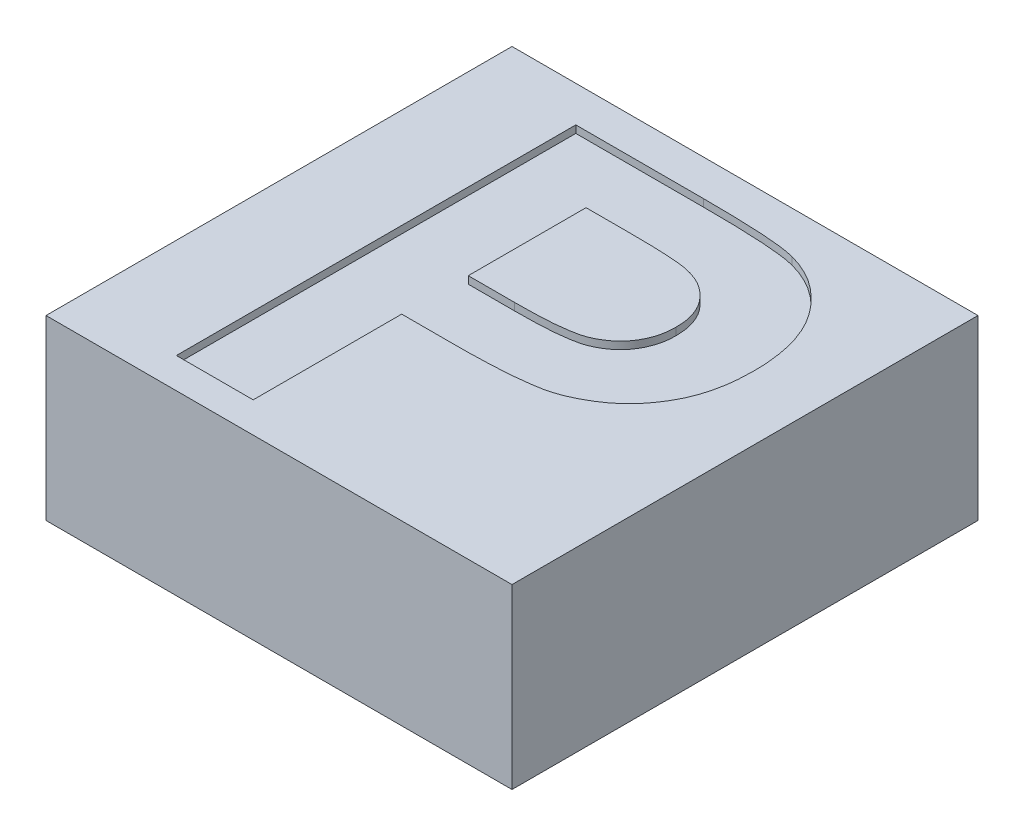
ISO-10303-21;
HEADER;
FILE_DESCRIPTION(('STEP AP214'),'2;1');
FILE_NAME('part.step','',(''),(''),'','','');
FILE_SCHEMA(('AUTOMOTIVE_DESIGN { 1 0 10303 214 1 1 1 1 }'));
ENDSEC;
DATA;
#1=APPLICATION_CONTEXT('core data for automotive mechanical design processes');
#2=APPLICATION_PROTOCOL_DEFINITION('international standard','automotive_design',2000,#1);
#3=PRODUCT_CONTEXT('',#1,'mechanical');
#4=PRODUCT('Part','Part','',(#3));
#5=PRODUCT_RELATED_PRODUCT_CATEGORY('part','',(#4));
#6=PRODUCT_DEFINITION_FORMATION('','',#4);
#7=PRODUCT_DEFINITION_CONTEXT('part definition',#1,'design');
#8=PRODUCT_DEFINITION('design','',#6,#7);
#9=PRODUCT_DEFINITION_SHAPE('','',#8);
#10=(LENGTH_UNIT() NAMED_UNIT(*) SI_UNIT(.MILLI.,.METRE.));
#11=(NAMED_UNIT(*) PLANE_ANGLE_UNIT() SI_UNIT($,.RADIAN.));
#12=(NAMED_UNIT(*) SI_UNIT($,.STERADIAN.) SOLID_ANGLE_UNIT());
#13=UNCERTAINTY_MEASURE_WITH_UNIT(LENGTH_MEASURE(1.E-05),#10,'distance_accuracy_value','');
#14=(GEOMETRIC_REPRESENTATION_CONTEXT(3) GLOBAL_UNCERTAINTY_ASSIGNED_CONTEXT((#13)) GLOBAL_UNIT_ASSIGNED_CONTEXT((#10,
#11,#12)) REPRESENTATION_CONTEXT('',''));
#15=CARTESIAN_POINT('',(0.,0.,0.));
#16=DIRECTION('',(0.,0.,1.));
#17=DIRECTION('',(1.,0.,0.));
#18=AXIS2_PLACEMENT_3D('',#15,#16,#17);
#19=CARTESIAN_POINT('',(0.,12.,0.));
#20=DIRECTION('',(0.,-1.,0.));
#21=DIRECTION('',(0.,0.,-1.));
#22=AXIS2_PLACEMENT_3D('',#19,#20,#21);
#23=PLANE('',#22);
#24=DIRECTION('',(0.,0.,1.));
#25=VECTOR('',#24,1.);
#26=CARTESIAN_POINT('',(0.,12.,0.));
#27=LINE('',#26,#25);
#28=CARTESIAN_POINT('',(0.,12.,-31.5));
#29=VERTEX_POINT('',#28);
#30=CARTESIAN_POINT('',(0.,12.,0.));
#31=VERTEX_POINT('',#30);
#32=EDGE_CURVE('E368',#29,#31,#27,.T.);
#33=ORIENTED_EDGE('',*,*,#32,.T.);
#34=DIRECTION('',(1.,0.,0.));
#35=VECTOR('',#34,1.);
#36=CARTESIAN_POINT('',(0.,12.,0.));
#37=LINE('',#36,#35);
#38=CARTESIAN_POINT('',(31.5,12.,0.));
#39=VERTEX_POINT('',#38);
#40=EDGE_CURVE('E372',#31,#39,#37,.T.);
#41=ORIENTED_EDGE('',*,*,#40,.T.);
#42=DIRECTION('',(0.,0.,-1.));
#43=VECTOR('',#42,1.);
#44=CARTESIAN_POINT('',(31.5,12.,0.));
#45=LINE('',#44,#43);
#46=CARTESIAN_POINT('',(31.5,12.,-31.5));
#47=VERTEX_POINT('',#46);
#48=EDGE_CURVE('E376',#39,#47,#45,.T.);
#49=ORIENTED_EDGE('',*,*,#48,.T.);
#50=DIRECTION('',(-1.,0.,0.));
#51=VECTOR('',#50,1.);
#52=CARTESIAN_POINT('',(0.,12.,-31.5));
#53=LINE('',#52,#51);
#54=EDGE_CURVE('E379',#47,#29,#53,.T.);
#55=ORIENTED_EDGE('',*,*,#54,.T.);
#56=EDGE_LOOP('',(#33,#41,#49,#55));
#57=FACE_BOUND('',#56,.T.);
#58=DIRECTION('',(-1.,0.,0.));
#59=VECTOR('',#58,1.);
#60=CARTESIAN_POINT('',(11.9399287114224,12.,-2.06550366549012));
#61=LINE('',#60,#59);
#62=CARTESIAN_POINT('',(11.9399287114224,12.,-2.06550366549012));
#63=VERTEX_POINT('',#62);
#64=CARTESIAN_POINT('',(6.74762101911471,12.,-2.06550366549012));
#65=VERTEX_POINT('',#64);
#66=EDGE_CURVE('E57',#63,#65,#61,.T.);
#67=ORIENTED_EDGE('',*,*,#66,.T.);
#68=DIRECTION('',(0.,0.,-1.));
#69=VECTOR('',#68,1.);
#70=CARTESIAN_POINT('',(6.74762101911471,12.,-2.06550366549012));
#71=LINE('',#70,#69);
#72=CARTESIAN_POINT('',(6.74762101911471,12.,-29.0655036654901));
#73=VERTEX_POINT('',#72);
#74=EDGE_CURVE('E289',#65,#73,#71,.T.);
#75=ORIENTED_EDGE('',*,*,#74,.T.);
#76=DIRECTION('',(1.,0.,0.));
#77=VECTOR('',#76,1.);
#78=CARTESIAN_POINT('',(6.74762101911471,12.,-29.0655036654901));
#79=LINE('',#78,#77);
#80=CARTESIAN_POINT('',(15.3852412114224,12.,-29.0655036654901));
#81=VERTEX_POINT('',#80);
#82=EDGE_CURVE('E293',#73,#81,#79,.T.);
#83=ORIENTED_EDGE('',*,*,#82,.T.);
#84=CARTESIAN_POINT('',(15.3852412114224,12.,-29.0655036654901));
#85=CARTESIAN_POINT('',(15.7764799612614,12.,-29.0650764142742));
#86=CARTESIAN_POINT('',(16.5247705810822,12.,-29.0642592455317));
#87=CARTESIAN_POINT('',(17.5921618875554,12.,-29.0415548746989));
#88=CARTESIAN_POINT('',(18.5531878465451,12.,-29.0094143358062));
#89=CARTESIAN_POINT('',(19.4064221410247,12.,-28.9693846546383));
#90=CARTESIAN_POINT('',(20.1548670784281,12.,-28.9096526823119));
#91=CARTESIAN_POINT('',(20.7951652190608,12.,-28.8404839570677));
#92=CARTESIAN_POINT('',(21.3313484783947,12.,-28.7660767638349));
#93=CARTESIAN_POINT('',(21.6470909161392,12.,-28.6890752702352));
#94=CARTESIAN_POINT('',(21.7890873652686,12.,-28.6544459731824));
#95=B_SPLINE_CURVE_WITH_KNOTS('',3,(#84,#85,#86,#87,#88,#89,#90,#91,#92,#93,#94),.UNSPECIFIED.,
.F.,.F.,(4,1,1,1,1,1,1,1,4),(0.,0.182560685864354,0.34916901466577,0.498161909879465,
0.631255146517796,0.747720654497027,0.848429126955914,0.931835182126824,1.),.UNSPECIFIED.);
#96=CARTESIAN_POINT('',(21.7890873652686,12.,-28.6544459731824));
#97=VERTEX_POINT('',#96);
#98=EDGE_CURVE('E297',#81,#97,#95,.T.);
#99=ORIENTED_EDGE('',*,*,#98,.T.);
#100=CARTESIAN_POINT('',(21.7890873652686,12.,-28.6544459731824));
#101=CARTESIAN_POINT('',(21.9779081123444,12.,-28.6006059017757));
#102=CARTESIAN_POINT('',(22.3526730574283,12.,-28.4937459739525));
#103=CARTESIAN_POINT('',(22.8895943580941,12.,-28.2659375821654));
#104=CARTESIAN_POINT('',(23.4071014704444,12.,-28.0019198093875));
#105=CARTESIAN_POINT('',(23.8986924719101,12.,-27.6872583471751));
#106=CARTESIAN_POINT('',(24.3660384345178,12.,-27.3275395472511));
#107=CARTESIAN_POINT('',(24.8105285246358,12.,-26.9256969630833));
#108=CARTESIAN_POINT('',(25.2345331441367,12.,-26.4799165937862));
#109=CARTESIAN_POINT('',(25.6321867341159,12.,-25.9910790515997));
#110=CARTESIAN_POINT('',(25.9963906435576,12.,-25.4616493091062));
#111=CARTESIAN_POINT('',(26.3111543284786,12.,-24.8908446164092));
#112=CARTESIAN_POINT('',(26.5748604830397,12.,-24.2811459836651));
#113=CARTESIAN_POINT('',(26.7995337440162,12.,-23.6371352200661));
#114=CARTESIAN_POINT('',(26.9652987474728,12.,-22.9519074861361));
#115=CARTESIAN_POINT('',(27.0813041129978,12.,-22.2302238222442));
#116=CARTESIAN_POINT('',(27.162058322044,12.,-21.471768579345));
#117=CARTESIAN_POINT('',(27.1677759698723,12.,-20.9527436692668));
#118=CARTESIAN_POINT('',(27.1706979421916,12.,-20.6874988577978));
#119=B_SPLINE_CURVE_WITH_KNOTS('',3,(#100,#101,#102,#103,#104,#105,#106,#107,#108,#109,#110,
#111,#112,#113,#114,#115,#116,#117,#118),.UNSPECIFIED.,.F.,.F.,(4,1,1,1,1,1,1,1,1,1,1,1,1,1,1,1,
4),(0.,0.0566966089636378,0.112529485629922,0.168226041849801,0.224453827384143,
0.280939346530923,0.338491443016692,0.397460189057406,0.458574525663164,0.520430686158554,
0.582933063936771,0.646631562091252,0.712213800813204,0.779824213865236,0.850065838275486,
0.923376975387565,1.),.UNSPECIFIED.);
#120=CARTESIAN_POINT('',(27.1706979421916,12.,-20.6874988577978));
#121=VERTEX_POINT('',#120);
#122=EDGE_CURVE('E303',#97,#121,#119,.T.);
#123=ORIENTED_EDGE('',*,*,#122,.T.);
#124=CARTESIAN_POINT('',(27.1706979421916,12.,-20.6874988577978));
#125=CARTESIAN_POINT('',(27.1623644922092,12.,-20.2846944556825));
#126=CARTESIAN_POINT('',(27.1463221434104,12.,-19.5092738639679));
#127=CARTESIAN_POINT('',(26.9668367254176,12.,-18.3976144616618));
#128=CARTESIAN_POINT('',(26.6930773089134,12.,-17.3821852611365));
#129=CARTESIAN_POINT('',(26.2929581416688,12.,-16.4727669530594));
#130=CARTESIAN_POINT('',(25.8051297571016,12.,-15.6657908277261));
#131=CARTESIAN_POINT('',(25.2677767479386,12.,-14.9383056619097));
#132=CARTESIAN_POINT('',(24.6541985789335,12.,-14.3122385973193));
#133=CARTESIAN_POINT('',(23.9912814929397,12.,-13.7774860580031));
#134=CARTESIAN_POINT('',(23.2906992923507,12.,-13.339866765951));
#135=CARTESIAN_POINT('',(22.5888488944963,12.,-12.9668025327091));
#136=CARTESIAN_POINT('',(21.8762598547262,12.,-12.6799788299512));
#137=CARTESIAN_POINT('',(21.3904182340538,12.,-12.5550074360021));
#138=CARTESIAN_POINT('',(21.1508662114224,12.,-12.4933882808747));
#139=B_SPLINE_CURVE_WITH_KNOTS('',3,(#124,#125,#126,#127,#128,#129,#130,#131,#132,#133,#134,
#135,#136,#137,#138),.UNSPECIFIED.,.F.,.F.,(4,1,1,1,1,1,1,1,1,1,1,1,4),(0.,0.109365519513396,
0.210534630229698,0.305156984724237,0.394451765400026,0.479483538783234,0.561008944761298,
0.639657023389005,0.717014175655741,0.791903899167707,0.86378270051793,0.932835870333303,1.),.UNSPECIFIED.);
#140=CARTESIAN_POINT('',(21.1508662114224,12.,-12.4933882808747));
#141=VERTEX_POINT('',#140);
#142=EDGE_CURVE('E312',#121,#141,#139,.T.);
#143=ORIENTED_EDGE('',*,*,#142,.T.);
#144=CARTESIAN_POINT('',(21.1508662114224,12.,-12.4933882808747));
#145=CARTESIAN_POINT('',(20.9798857262309,12.,-12.460863774381));
#146=CARTESIAN_POINT('',(20.6194792638842,12.,-12.3923059953347));
#147=CARTESIAN_POINT('',(20.0478961747213,12.,-12.3239663675352));
#148=CARTESIAN_POINT('',(19.4231248806272,12.,-12.248321850322));
#149=CARTESIAN_POINT('',(18.7425956551299,12.,-12.1989822460935));
#150=CARTESIAN_POINT('',(18.0071317612272,12.,-12.1527777753686));
#151=CARTESIAN_POINT('',(17.2170187821548,12.,-12.1309631193009));
#152=CARTESIAN_POINT('',(16.3733858739426,12.,-12.1046808886025));
#153=CARTESIAN_POINT('',(15.7927191740633,12.,-12.1042086298942));
#154=CARTESIAN_POINT('',(15.4934142883455,12.,-12.1039652039517));
#155=B_SPLINE_CURVE_WITH_KNOTS('',3,(#144,#145,#146,#147,#148,#149,#150,#151,#152,#153,#154),
.UNSPECIFIED.,.F.,.F.,(4,1,1,1,1,1,1,1,4),(0.,0.091919243260635,0.193754797502382,
0.303983189193222,0.424368181524799,0.554124139817009,0.693262123791844,0.841891837429478,1.),.UNSPECIFIED.);
#156=CARTESIAN_POINT('',(15.4934142883455,12.,-12.1039652039517));
#157=VERTEX_POINT('',#156);
#158=EDGE_CURVE('E321',#141,#157,#155,.T.);
#159=ORIENTED_EDGE('',*,*,#158,.T.);
#160=DIRECTION('',(-1.,0.,0.));
#161=VECTOR('',#160,1.);
#162=CARTESIAN_POINT('',(15.4934142883455,12.,-12.1039652039517));
#163=LINE('',#162,#161);
#164=CARTESIAN_POINT('',(11.9399287114224,12.,-12.1039652039517));
#165=VERTEX_POINT('',#164);
#166=EDGE_CURVE('E330',#157,#165,#163,.T.);
#167=ORIENTED_EDGE('',*,*,#166,.T.);
#168=DIRECTION('',(0.,0.,1.));
#169=VECTOR('',#168,1.);
#170=CARTESIAN_POINT('',(11.9399287114224,12.,-12.1039652039517));
#171=LINE('',#170,#169);
#172=EDGE_CURVE('E337',#165,#63,#171,.T.);
#173=ORIENTED_EDGE('',*,*,#172,.T.);
#174=EDGE_LOOP('',(#67,#75,#83,#99,#123,#143,#159,#167,#173));
#175=FACE_BOUND('',#174,.T.);
#176=ADVANCED_FACE('F41',(#57,#175),#23,.F.);
#177=CARTESIAN_POINT('',(0.,12.,0.));
#178=DIRECTION('',(1.,0.,0.));
#179=DIRECTION('',(0.,0.,-1.));
#180=AXIS2_PLACEMENT_3D('',#177,#178,#179);
#181=PLANE('',#180);
#182=DIRECTION('',(0.,0.,1.));
#183=VECTOR('',#182,1.);
#184=CARTESIAN_POINT('',(0.,0.,0.));
#185=LINE('',#184,#183);
#186=CARTESIAN_POINT('',(0.,0.,-31.5));
#187=VERTEX_POINT('',#186);
#188=CARTESIAN_POINT('',(0.,0.,0.));
#189=VERTEX_POINT('',#188);
#190=EDGE_CURVE('E367',#187,#189,#185,.T.);
#191=ORIENTED_EDGE('',*,*,#190,.T.);
#192=DIRECTION('',(0.,-1.,0.));
#193=VECTOR('',#192,1.);
#194=CARTESIAN_POINT('',(0.,12.,0.));
#195=LINE('',#194,#193);
#196=EDGE_CURVE('E11',#31,#189,#195,.T.);
#197=ORIENTED_EDGE('',*,*,#196,.F.);
#198=ORIENTED_EDGE('',*,*,#32,.F.);
#199=DIRECTION('',(0.,-1.,0.));
#200=VECTOR('',#199,1.);
#201=CARTESIAN_POINT('',(0.,12.,-31.5));
#202=LINE('',#201,#200);
#203=EDGE_CURVE('E382',#29,#187,#202,.T.);
#204=ORIENTED_EDGE('',*,*,#203,.T.);
#205=EDGE_LOOP('',(#191,#197,#198,#204));
#206=FACE_BOUND('',#205,.T.);
#207=ADVANCED_FACE('F43',(#206),#181,.F.);
#208=CARTESIAN_POINT('',(0.,12.,0.));
#209=DIRECTION('',(0.,0.,-1.));
#210=DIRECTION('',(-1.,0.,0.));
#211=AXIS2_PLACEMENT_3D('',#208,#209,#210);
#212=PLANE('',#211);
#213=DIRECTION('',(1.,0.,0.));
#214=VECTOR('',#213,1.);
#215=CARTESIAN_POINT('',(0.,0.,0.));
#216=LINE('',#215,#214);
#217=CARTESIAN_POINT('',(31.5,0.,0.));
#218=VERTEX_POINT('',#217);
#219=EDGE_CURVE('E386',#189,#218,#216,.T.);
#220=ORIENTED_EDGE('',*,*,#219,.T.);
#221=DIRECTION('',(0.,-1.,0.));
#222=VECTOR('',#221,1.);
#223=CARTESIAN_POINT('',(31.5,12.,0.));
#224=LINE('',#223,#222);
#225=EDGE_CURVE('E50',#39,#218,#224,.T.);
#226=ORIENTED_EDGE('',*,*,#225,.F.);
#227=ORIENTED_EDGE('',*,*,#40,.F.);
#228=ORIENTED_EDGE('',*,*,#196,.T.);
#229=EDGE_LOOP('',(#220,#226,#227,#228));
#230=FACE_BOUND('',#229,.T.);
#231=ADVANCED_FACE('F422',(#230),#212,.F.);
#232=CARTESIAN_POINT('',(31.5,12.,0.));
#233=DIRECTION('',(-1.,0.,0.));
#234=DIRECTION('',(0.,0.,1.));
#235=AXIS2_PLACEMENT_3D('',#232,#233,#234);
#236=PLANE('',#235);
#237=DIRECTION('',(0.,0.,-1.));
#238=VECTOR('',#237,1.);
#239=CARTESIAN_POINT('',(31.5,0.,0.));
#240=LINE('',#239,#238);
#241=CARTESIAN_POINT('',(31.5,0.,-31.5));
#242=VERTEX_POINT('',#241);
#243=EDGE_CURVE('E388',#218,#242,#240,.T.);
#244=ORIENTED_EDGE('',*,*,#243,.T.);
#245=DIRECTION('',(0.,-1.,0.));
#246=VECTOR('',#245,1.);
#247=CARTESIAN_POINT('',(31.5,12.,-31.5));
#248=LINE('',#247,#246);
#249=EDGE_CURVE('E396',#47,#242,#248,.T.);
#250=ORIENTED_EDGE('',*,*,#249,.F.);
#251=ORIENTED_EDGE('',*,*,#48,.F.);
#252=ORIENTED_EDGE('',*,*,#225,.T.);
#253=EDGE_LOOP('',(#244,#250,#251,#252));
#254=FACE_BOUND('',#253,.T.);
#255=ADVANCED_FACE('F406',(#254),#236,.F.);
#256=CARTESIAN_POINT('',(0.,12.,-31.5));
#257=DIRECTION('',(0.,0.,1.));
#258=DIRECTION('',(1.,0.,0.));
#259=AXIS2_PLACEMENT_3D('',#256,#257,#258);
#260=PLANE('',#259);
#261=DIRECTION('',(-1.,0.,0.));
#262=VECTOR('',#261,1.);
#263=CARTESIAN_POINT('',(0.,0.,-31.5));
#264=LINE('',#263,#262);
#265=EDGE_CURVE('E373',#242,#187,#264,.T.);
#266=ORIENTED_EDGE('',*,*,#265,.T.);
#267=ORIENTED_EDGE('',*,*,#203,.F.);
#268=ORIENTED_EDGE('',*,*,#54,.F.);
#269=ORIENTED_EDGE('',*,*,#249,.T.);
#270=EDGE_LOOP('',(#266,#267,#268,#269));
#271=FACE_BOUND('',#270,.T.);
#272=ADVANCED_FACE('F415',(#271),#260,.F.);
#273=CARTESIAN_POINT('',(0.,0.,0.));
#274=DIRECTION('',(0.,-1.,0.));
#275=DIRECTION('',(0.,0.,-1.));
#276=AXIS2_PLACEMENT_3D('',#273,#274,#275);
#277=PLANE('',#276);
#278=ORIENTED_EDGE('',*,*,#190,.F.);
#279=ORIENTED_EDGE('',*,*,#265,.F.);
#280=ORIENTED_EDGE('',*,*,#243,.F.);
#281=ORIENTED_EDGE('',*,*,#219,.F.);
#282=EDGE_LOOP('',(#278,#279,#280,#281));
#283=FACE_BOUND('',#282,.T.);
#284=ADVANCED_FACE('F412',(#283),#277,.T.);
#285=CARTESIAN_POINT('',(11.9399287114224,11.5,-2.06550366549012));
#286=DIRECTION('',(0.,0.,-1.));
#287=DIRECTION('',(-1.,0.,0.));
#288=AXIS2_PLACEMENT_3D('',#285,#286,#287);
#289=PLANE('',#288);
#290=ORIENTED_EDGE('',*,*,#66,.F.);
#291=DIRECTION('',(0.,1.,0.));
#292=VECTOR('',#291,1.);
#293=CARTESIAN_POINT('',(11.9399287114224,11.5,-2.06550366549012));
#294=LINE('',#293,#292);
#295=CARTESIAN_POINT('',(11.9399287114224,11.5,-2.06550366549012));
#296=VERTEX_POINT('',#295);
#297=EDGE_CURVE('E286',#296,#63,#294,.T.);
#298=ORIENTED_EDGE('',*,*,#297,.F.);
#299=DIRECTION('',(-1.,0.,0.));
#300=VECTOR('',#299,1.);
#301=CARTESIAN_POINT('',(11.9399287114224,11.5,-2.06550366549012));
#302=LINE('',#301,#300);
#303=CARTESIAN_POINT('',(6.74762101911471,11.5,-2.06550366549012));
#304=VERTEX_POINT('',#303);
#305=EDGE_CURVE('E341',#296,#304,#302,.T.);
#306=ORIENTED_EDGE('',*,*,#305,.T.);
#307=DIRECTION('',(0.,1.,0.));
#308=VECTOR('',#307,1.);
#309=CARTESIAN_POINT('',(6.74762101911471,11.5,-2.06550366549012));
#310=LINE('',#309,#308);
#311=EDGE_CURVE('E365',#304,#65,#310,.T.);
#312=ORIENTED_EDGE('',*,*,#311,.T.);
#313=EDGE_LOOP('',(#290,#298,#306,#312));
#314=FACE_BOUND('',#313,.T.);
#315=ADVANCED_FACE('F518',(#314),#289,.T.);
#316=CARTESIAN_POINT('',(6.74762101911471,11.5,-2.06550366549012));
#317=DIRECTION('',(1.,0.,0.));
#318=DIRECTION('',(0.,0.,-1.));
#319=AXIS2_PLACEMENT_3D('',#316,#317,#318);
#320=PLANE('',#319);
#321=ORIENTED_EDGE('',*,*,#74,.F.);
#322=ORIENTED_EDGE('',*,*,#311,.F.);
#323=DIRECTION('',(0.,0.,-1.));
#324=VECTOR('',#323,1.);
#325=CARTESIAN_POINT('',(6.74762101911471,11.5,-2.06550366549012));
#326=LINE('',#325,#324);
#327=CARTESIAN_POINT('',(6.74762101911471,11.5,-29.0655036654901));
#328=VERTEX_POINT('',#327);
#329=EDGE_CURVE('E489',#304,#328,#326,.T.);
#330=ORIENTED_EDGE('',*,*,#329,.T.);
#331=DIRECTION('',(0.,1.,0.));
#332=VECTOR('',#331,1.);
#333=CARTESIAN_POINT('',(6.74762101911471,11.5,-29.0655036654901));
#334=LINE('',#333,#332);
#335=EDGE_CURVE('E362',#328,#73,#334,.T.);
#336=ORIENTED_EDGE('',*,*,#335,.T.);
#337=EDGE_LOOP('',(#321,#322,#330,#336));
#338=FACE_BOUND('',#337,.T.);
#339=ADVANCED_FACE('F515',(#338),#320,.T.);
#340=CARTESIAN_POINT('',(6.74762101911471,11.5,-29.0655036654901));
#341=DIRECTION('',(0.,0.,1.));
#342=DIRECTION('',(1.,0.,0.));
#343=AXIS2_PLACEMENT_3D('',#340,#341,#342);
#344=PLANE('',#343);
#345=ORIENTED_EDGE('',*,*,#82,.F.);
#346=ORIENTED_EDGE('',*,*,#335,.F.);
#347=DIRECTION('',(1.,0.,0.));
#348=VECTOR('',#347,1.);
#349=CARTESIAN_POINT('',(6.74762101911471,11.5,-29.0655036654901));
#350=LINE('',#349,#348);
#351=CARTESIAN_POINT('',(15.3852412114224,11.5,-29.0655036654901));
#352=VERTEX_POINT('',#351);
#353=EDGE_CURVE('E492',#328,#352,#350,.T.);
#354=ORIENTED_EDGE('',*,*,#353,.T.);
#355=DIRECTION('',(0.,1.,0.));
#356=VECTOR('',#355,1.);
#357=CARTESIAN_POINT('',(15.3852412114224,11.5,-29.0655036654901));
#358=LINE('',#357,#356);
#359=EDGE_CURVE('E359',#352,#81,#358,.T.);
#360=ORIENTED_EDGE('',*,*,#359,.T.);
#361=EDGE_LOOP('',(#345,#346,#354,#360));
#362=FACE_BOUND('',#361,.T.);
#363=ADVANCED_FACE('F511',(#362),#344,.T.);
#364=CARTESIAN_POINT('',(15.3852412114224,11.5,-29.0655036654901));
#365=CARTESIAN_POINT('',(15.7764799612614,11.5,-29.0650764142742));
#366=CARTESIAN_POINT('',(16.5247705810822,11.5,-29.0642592455317));
#367=CARTESIAN_POINT('',(17.5921618875554,11.5,-29.0415548746989));
#368=CARTESIAN_POINT('',(18.5531878465451,11.5,-29.0094143358062));
#369=CARTESIAN_POINT('',(19.4064221410247,11.5,-28.9693846546383));
#370=CARTESIAN_POINT('',(20.1548670784281,11.5,-28.9096526823119));
#371=CARTESIAN_POINT('',(20.7951652190608,11.5,-28.8404839570677));
#372=CARTESIAN_POINT('',(21.3313484783947,11.5,-28.7660767638349));
#373=CARTESIAN_POINT('',(21.6470909161392,11.5,-28.6890752702352));
#374=CARTESIAN_POINT('',(21.7890873652686,11.5,-28.6544459731824));
#375=B_SPLINE_CURVE_WITH_KNOTS('',3,(#364,#365,#366,#367,#368,#369,#370,#371,#372,#373,#374),
.UNSPECIFIED.,.F.,.F.,(4,1,1,1,1,1,1,1,4),(0.,0.182560685864354,0.34916901466577,
0.498161909879465,0.631255146517796,0.747720654497027,0.848429126955914,0.931835182126824,1.),.UNSPECIFIED.);
#376=DIRECTION('',(0.,1.,0.));
#377=VECTOR('',#376,1.);
#378=SURFACE_OF_LINEAR_EXTRUSION('',#375,#377);
#379=ORIENTED_EDGE('',*,*,#98,.F.);
#380=ORIENTED_EDGE('',*,*,#359,.F.);
#381=CARTESIAN_POINT('',(21.7890873652686,11.5,-28.6544459731824));
#382=VERTEX_POINT('',#381);
#383=EDGE_CURVE('E495',#352,#382,#375,.T.);
#384=ORIENTED_EDGE('',*,*,#383,.T.);
#385=DIRECTION('',(0.,1.,0.));
#386=VECTOR('',#385,1.);
#387=CARTESIAN_POINT('',(21.7890873652686,11.5,-28.6544459731824));
#388=LINE('',#387,#386);
#389=EDGE_CURVE('E356',#382,#97,#388,.T.);
#390=ORIENTED_EDGE('',*,*,#389,.T.);
#391=EDGE_LOOP('',(#379,#380,#384,#390));
#392=FACE_BOUND('',#391,.T.);
#393=ADVANCED_FACE('F507',(#392),#378,.T.);
#394=CARTESIAN_POINT('',(21.7890873652686,11.5,-28.6544459731824));
#395=CARTESIAN_POINT('',(21.9779081123444,11.5,-28.6006059017757));
#396=CARTESIAN_POINT('',(22.3526730574283,11.5,-28.4937459739525));
#397=CARTESIAN_POINT('',(22.8895943580941,11.5,-28.2659375821654));
#398=CARTESIAN_POINT('',(23.4071014704444,11.5,-28.0019198093875));
#399=CARTESIAN_POINT('',(23.8986924719101,11.5,-27.6872583471751));
#400=CARTESIAN_POINT('',(24.3660384345178,11.5,-27.3275395472511));
#401=CARTESIAN_POINT('',(24.8105285246358,11.5,-26.9256969630833));
#402=CARTESIAN_POINT('',(25.2345331441367,11.5,-26.4799165937862));
#403=CARTESIAN_POINT('',(25.6321867341159,11.5,-25.9910790515997));
#404=CARTESIAN_POINT('',(25.9963906435576,11.5,-25.4616493091062));
#405=CARTESIAN_POINT('',(26.3111543284786,11.5,-24.8908446164092));
#406=CARTESIAN_POINT('',(26.5748604830397,11.5,-24.2811459836651));
#407=CARTESIAN_POINT('',(26.7995337440162,11.5,-23.6371352200661));
#408=CARTESIAN_POINT('',(26.9652987474728,11.5,-22.9519074861361));
#409=CARTESIAN_POINT('',(27.0813041129978,11.5,-22.2302238222442));
#410=CARTESIAN_POINT('',(27.162058322044,11.5,-21.471768579345));
#411=CARTESIAN_POINT('',(27.1677759698723,11.5,-20.9527436692668));
#412=CARTESIAN_POINT('',(27.1706979421916,11.5,-20.6874988577978));
#413=B_SPLINE_CURVE_WITH_KNOTS('',3,(#394,#395,#396,#397,#398,#399,#400,#401,#402,#403,#404,
#405,#406,#407,#408,#409,#410,#411,#412),.UNSPECIFIED.,.F.,.F.,(4,1,1,1,1,1,1,1,1,1,1,1,1,1,1,1,
4),(0.,0.0566966089636378,0.112529485629922,0.168226041849801,0.224453827384143,
0.280939346530923,0.338491443016692,0.397460189057406,0.458574525663164,0.520430686158554,
0.582933063936771,0.646631562091252,0.712213800813204,0.779824213865236,0.850065838275486,
0.923376975387565,1.),.UNSPECIFIED.);
#414=DIRECTION('',(0.,1.,0.));
#415=VECTOR('',#414,1.);
#416=SURFACE_OF_LINEAR_EXTRUSION('',#413,#415);
#417=ORIENTED_EDGE('',*,*,#122,.F.);
#418=ORIENTED_EDGE('',*,*,#389,.F.);
#419=CARTESIAN_POINT('',(27.1706979421916,11.5,-20.6874988577978));
#420=VERTEX_POINT('',#419);
#421=EDGE_CURVE('E499',#382,#420,#413,.T.);
#422=ORIENTED_EDGE('',*,*,#421,.T.);
#423=DIRECTION('',(0.,1.,0.));
#424=VECTOR('',#423,1.);
#425=CARTESIAN_POINT('',(27.1706979421916,11.5,-20.6874988577978));
#426=LINE('',#425,#424);
#427=EDGE_CURVE('E353',#420,#121,#426,.T.);
#428=ORIENTED_EDGE('',*,*,#427,.T.);
#429=EDGE_LOOP('',(#417,#418,#422,#428));
#430=FACE_BOUND('',#429,.T.);
#431=ADVANCED_FACE('F510',(#430),#416,.T.);
#432=CARTESIAN_POINT('',(27.1706979421916,11.5,-20.6874988577978));
#433=CARTESIAN_POINT('',(27.1623644922092,11.5,-20.2846944556825));
#434=CARTESIAN_POINT('',(27.1463221434104,11.5,-19.5092738639679));
#435=CARTESIAN_POINT('',(26.9668367254176,11.5,-18.3976144616618));
#436=CARTESIAN_POINT('',(26.6930773089134,11.5,-17.3821852611365));
#437=CARTESIAN_POINT('',(26.2929581416688,11.5,-16.4727669530594));
#438=CARTESIAN_POINT('',(25.8051297571016,11.5,-15.6657908277261));
#439=CARTESIAN_POINT('',(25.2677767479386,11.5,-14.9383056619097));
#440=CARTESIAN_POINT('',(24.6541985789335,11.5,-14.3122385973193));
#441=CARTESIAN_POINT('',(23.9912814929397,11.5,-13.7774860580031));
#442=CARTESIAN_POINT('',(23.2906992923507,11.5,-13.339866765951));
#443=CARTESIAN_POINT('',(22.5888488944963,11.5,-12.9668025327091));
#444=CARTESIAN_POINT('',(21.8762598547262,11.5,-12.6799788299512));
#445=CARTESIAN_POINT('',(21.3904182340538,11.5,-12.5550074360021));
#446=CARTESIAN_POINT('',(21.1508662114224,11.5,-12.4933882808747));
#447=B_SPLINE_CURVE_WITH_KNOTS('',3,(#432,#433,#434,#435,#436,#437,#438,#439,#440,#441,#442,
#443,#444,#445,#446),.UNSPECIFIED.,.F.,.F.,(4,1,1,1,1,1,1,1,1,1,1,1,4),(0.,0.109365519513396,
0.210534630229698,0.305156984724237,0.394451765400026,0.479483538783234,0.561008944761298,
0.639657023389005,0.717014175655741,0.791903899167707,0.86378270051793,0.932835870333303,1.),.UNSPECIFIED.);
#448=DIRECTION('',(0.,1.,0.));
#449=VECTOR('',#448,1.);
#450=SURFACE_OF_LINEAR_EXTRUSION('',#447,#449);
#451=ORIENTED_EDGE('',*,*,#142,.F.);
#452=ORIENTED_EDGE('',*,*,#427,.F.);
#453=CARTESIAN_POINT('',(21.1508662114224,11.5,-12.4933882808747));
#454=VERTEX_POINT('',#453);
#455=EDGE_CURVE('E273',#420,#454,#447,.T.);
#456=ORIENTED_EDGE('',*,*,#455,.T.);
#457=DIRECTION('',(0.,1.,0.));
#458=VECTOR('',#457,1.);
#459=CARTESIAN_POINT('',(21.1508662114224,11.5,-12.4933882808747));
#460=LINE('',#459,#458);
#461=EDGE_CURVE('E350',#454,#141,#460,.T.);
#462=ORIENTED_EDGE('',*,*,#461,.T.);
#463=EDGE_LOOP('',(#451,#452,#456,#462));
#464=FACE_BOUND('',#463,.T.);
#465=ADVANCED_FACE('F262',(#464),#450,.T.);
#466=CARTESIAN_POINT('',(21.1508662114224,11.5,-12.4933882808747));
#467=CARTESIAN_POINT('',(20.9798857262309,11.5,-12.460863774381));
#468=CARTESIAN_POINT('',(20.6194792638842,11.5,-12.3923059953347));
#469=CARTESIAN_POINT('',(20.0478961747213,11.5,-12.3239663675352));
#470=CARTESIAN_POINT('',(19.4231248806272,11.5,-12.248321850322));
#471=CARTESIAN_POINT('',(18.7425956551299,11.5,-12.1989822460935));
#472=CARTESIAN_POINT('',(18.0071317612272,11.5,-12.1527777753686));
#473=CARTESIAN_POINT('',(17.2170187821548,11.5,-12.1309631193009));
#474=CARTESIAN_POINT('',(16.3733858739426,11.5,-12.1046808886025));
#475=CARTESIAN_POINT('',(15.7927191740633,11.5,-12.1042086298942));
#476=CARTESIAN_POINT('',(15.4934142883455,11.5,-12.1039652039517));
#477=B_SPLINE_CURVE_WITH_KNOTS('',3,(#466,#467,#468,#469,#470,#471,#472,#473,#474,#475,#476),
.UNSPECIFIED.,.F.,.F.,(4,1,1,1,1,1,1,1,4),(0.,0.091919243260635,0.193754797502382,
0.303983189193222,0.424368181524799,0.554124139817009,0.693262123791844,0.841891837429478,1.),.UNSPECIFIED.);
#478=DIRECTION('',(0.,1.,0.));
#479=VECTOR('',#478,1.);
#480=SURFACE_OF_LINEAR_EXTRUSION('',#477,#479);
#481=ORIENTED_EDGE('',*,*,#158,.F.);
#482=ORIENTED_EDGE('',*,*,#461,.F.);
#483=CARTESIAN_POINT('',(15.4934142883455,11.5,-12.1039652039517));
#484=VERTEX_POINT('',#483);
#485=EDGE_CURVE('E266',#454,#484,#477,.T.);
#486=ORIENTED_EDGE('',*,*,#485,.T.);
#487=DIRECTION('',(0.,1.,0.));
#488=VECTOR('',#487,1.);
#489=CARTESIAN_POINT('',(15.4934142883455,11.5,-12.1039652039517));
#490=LINE('',#489,#488);
#491=EDGE_CURVE('E347',#484,#157,#490,.T.);
#492=ORIENTED_EDGE('',*,*,#491,.T.);
#493=EDGE_LOOP('',(#481,#482,#486,#492));
#494=FACE_BOUND('',#493,.T.);
#495=ADVANCED_FACE('F257',(#494),#480,.T.);
#496=CARTESIAN_POINT('',(15.4934142883455,11.5,-12.1039652039517));
#497=DIRECTION('',(0.,0.,-1.));
#498=DIRECTION('',(-1.,0.,0.));
#499=AXIS2_PLACEMENT_3D('',#496,#497,#498);
#500=PLANE('',#499);
#501=ORIENTED_EDGE('',*,*,#166,.F.);
#502=ORIENTED_EDGE('',*,*,#491,.F.);
#503=DIRECTION('',(-1.,0.,0.));
#504=VECTOR('',#503,1.);
#505=CARTESIAN_POINT('',(15.4934142883455,11.5,-12.1039652039517));
#506=LINE('',#505,#504);
#507=CARTESIAN_POINT('',(11.9399287114224,11.5,-12.1039652039517));
#508=VERTEX_POINT('',#507);
#509=EDGE_CURVE('E272',#484,#508,#506,.T.);
#510=ORIENTED_EDGE('',*,*,#509,.T.);
#511=DIRECTION('',(0.,1.,0.));
#512=VECTOR('',#511,1.);
#513=CARTESIAN_POINT('',(11.9399287114224,11.5,-12.1039652039517));
#514=LINE('',#513,#512);
#515=EDGE_CURVE('E344',#508,#165,#514,.T.);
#516=ORIENTED_EDGE('',*,*,#515,.T.);
#517=EDGE_LOOP('',(#501,#502,#510,#516));
#518=FACE_BOUND('',#517,.T.);
#519=ADVANCED_FACE('F253',(#518),#500,.T.);
#520=CARTESIAN_POINT('',(11.9399287114224,11.5,-12.1039652039517));
#521=DIRECTION('',(-1.,0.,0.));
#522=DIRECTION('',(0.,0.,1.));
#523=AXIS2_PLACEMENT_3D('',#520,#521,#522);
#524=PLANE('',#523);
#525=ORIENTED_EDGE('',*,*,#172,.F.);
#526=ORIENTED_EDGE('',*,*,#515,.F.);
#527=DIRECTION('',(0.,0.,1.));
#528=VECTOR('',#527,1.);
#529=CARTESIAN_POINT('',(11.9399287114224,11.5,-12.1039652039517));
#530=LINE('',#529,#528);
#531=EDGE_CURVE('E283',#508,#296,#530,.T.);
#532=ORIENTED_EDGE('',*,*,#531,.T.);
#533=ORIENTED_EDGE('',*,*,#297,.T.);
#534=EDGE_LOOP('',(#525,#526,#532,#533));
#535=FACE_BOUND('',#534,.T.);
#536=ADVANCED_FACE('F250',(#535),#524,.T.);
#537=CARTESIAN_POINT('',(18.5989719836484,11.5,-29.0055285352843));
#538=DIRECTION('',(0.,1.,-6.95932071551576E-13));
#539=DIRECTION('',(0.,6.95932071551576E-13,1.));
#540=AXIS2_PLACEMENT_3D('',#537,#538,#539);
#541=PLANE('',#540);
#542=CARTESIAN_POINT('',(18.7872844806532,11.5,-24.3762007808747));
#543=CARTESIAN_POINT('',(18.691845039605,11.5,-24.3914655413093));
#544=CARTESIAN_POINT('',(18.47999907132,11.5,-24.4253485766603));
#545=CARTESIAN_POINT('',(18.1278679586685,11.5,-24.4607097379153));
#546=CARTESIAN_POINT('',(17.711296797271,11.5,-24.4928706784905));
#547=CARTESIAN_POINT('',(17.2297834507063,11.5,-24.5192757715496));
#548=CARTESIAN_POINT('',(16.6852365178251,11.5,-24.5399184401756));
#549=CARTESIAN_POINT('',(16.0758598377316,11.5,-24.5580065089614));
#550=CARTESIAN_POINT('',(15.4032583200865,11.5,-24.5594596450609));
#551=CARTESIAN_POINT('',(14.9327127686159,11.5,-24.5634331730647));
#552=CARTESIAN_POINT('',(14.6875248652686,11.5,-24.5655036654901));
#553=B_SPLINE_CURVE_WITH_KNOTS('',3,(#542,#543,#544,#545,#546,#547,#548,#549,#550,#551,#552),
.UNSPECIFIED.,.F.,.F.,(4,1,1,1,1,1,1,1,4),(0.,0.0705753751012045,0.15665545094565,
0.258348344782106,0.375719036051342,0.508809542827526,0.656332342734556,0.82092455858982,1.),.UNSPECIFIED.);
#554=CARTESIAN_POINT('',(18.7872844806532,11.5,-24.3762007808747));
#555=VERTEX_POINT('',#554);
#556=CARTESIAN_POINT('',(14.6875248652686,11.5,-24.5655036654901));
#557=VERTEX_POINT('',#556);
#558=EDGE_CURVE('E188',#555,#557,#553,.T.);
#559=ORIENTED_EDGE('',*,*,#558,.F.);
#560=CARTESIAN_POINT('',(21.9783902498839,11.5,-20.6063690501055));
#561=CARTESIAN_POINT('',(21.9698875494565,11.5,-20.8509869892849));
#562=CARTESIAN_POINT('',(21.9534019344362,11.5,-21.3252689196857));
#563=CARTESIAN_POINT('',(21.7716116200156,11.5,-22.000725542892));
#564=CARTESIAN_POINT('',(21.4911299380357,11.5,-22.6137106171085));
#565=CARTESIAN_POINT('',(21.0901207636189,11.5,-23.1451514099537));
#566=CARTESIAN_POINT('',(20.6057111190815,11.5,-23.5920494132682));
#567=CARTESIAN_POINT('',(20.0612548953113,11.5,-23.9638844407385));
#568=CARTESIAN_POINT('',(19.4451249831862,11.5,-24.2240974234997));
#569=CARTESIAN_POINT('',(19.0090701509505,11.5,-24.3249203490071));
#570=CARTESIAN_POINT('',(18.7872844806532,11.5,-24.3762007808747));
#571=B_SPLINE_CURVE_WITH_KNOTS('',3,(#560,#561,#562,#563,#564,#565,#566,#567,#568,#569,#570),
.UNSPECIFIED.,.F.,.F.,(4,1,1,1,1,1,1,1,4),(0.,0.135738070383498,0.263178220969093,
0.386088136374911,0.508621177402749,0.630648535451455,0.751346205248274,0.873530013970424,1.),.UNSPECIFIED.);
#572=CARTESIAN_POINT('',(21.9783902498839,11.5,-20.6063690501055));
#573=VERTEX_POINT('',#572);
#574=EDGE_CURVE('E223',#573,#555,#571,.T.);
#575=ORIENTED_EDGE('',*,*,#574,.F.);
#576=CARTESIAN_POINT('',(15.055313326807,11.5,-16.6039652039517));
#577=CARTESIAN_POINT('',(15.3239667293195,11.5,-16.604313087429));
#578=CARTESIAN_POINT('',(15.8379344893729,11.5,-16.6049786322906));
#579=CARTESIAN_POINT('',(16.5753642135181,11.5,-16.6288677894291));
#580=CARTESIAN_POINT('',(17.2428862988049,11.5,-16.6580289358267));
#581=CARTESIAN_POINT('',(17.8418955092207,11.5,-16.7062965997802));
#582=CARTESIAN_POINT('',(18.3687760665924,11.5,-16.7699122268648));
#583=CARTESIAN_POINT('',(18.8270563609955,11.5,-16.8460045291502));
#584=CARTESIAN_POINT('',(19.2172705073766,11.5,-16.9276595194935));
#585=CARTESIAN_POINT('',(19.6392339836765,11.5,-17.0629749235028));
#586=CARTESIAN_POINT('',(20.0903973041238,11.5,-17.2819029082246));
#587=CARTESIAN_POINT('',(20.5721867093086,11.5,-17.596557411208));
#588=CARTESIAN_POINT('',(20.9954381328356,11.5,-17.9727639795939));
#589=CARTESIAN_POINT('',(21.3476394172757,11.5,-18.414605566412));
#590=CARTESIAN_POINT('',(21.6289702661519,11.5,-18.9055171688497));
#591=CARTESIAN_POINT('',(21.8304033588552,11.5,-19.4404677624804));
#592=CARTESIAN_POINT('',(21.9604685175225,11.5,-20.0105913450403));
#593=CARTESIAN_POINT('',(21.972348784071,11.5,-20.4055307290837));
#594=CARTESIAN_POINT('',(21.9783902498839,11.5,-20.6063690501055));
#595=B_SPLINE_CURVE_WITH_KNOTS('',3,(#576,#577,#578,#579,#580,#581,#582,#583,#584,#585,#586,
#587,#588,#589,#590,#591,#592,#593,#594),.UNSPECIFIED.,.F.,.F.,(4,1,1,1,1,1,1,1,1,1,1,1,1,1,1,1,
4),(0.,0.0882316223837538,0.168798194619351,0.242310106178018,0.30766373202845,
0.366127388811563,0.41655369001194,0.46022816225266,0.496931612906356,0.561824891954991,
0.624233737849063,0.685457084882651,0.746954721198572,0.809017075528236,0.870491901147409,
0.934141313368152,1.),.UNSPECIFIED.);
#596=CARTESIAN_POINT('',(15.055313326807,11.5,-16.6039652039517));
#597=VERTEX_POINT('',#596);
#598=EDGE_CURVE('E216',#597,#573,#595,.T.);
#599=ORIENTED_EDGE('',*,*,#598,.F.);
#600=DIRECTION('',(1.,0.,0.));
#601=VECTOR('',#600,1.);
#602=CARTESIAN_POINT('',(11.9399287114224,11.5,-16.6039652039517));
#603=LINE('',#602,#601);
#604=CARTESIAN_POINT('',(11.9399287114224,11.5000000000087,-16.6039652039517));
#605=VERTEX_POINT('',#604);
#606=EDGE_CURVE('E199',#605,#597,#603,.T.);
#607=ORIENTED_EDGE('',*,*,#606,.F.);
#608=DIRECTION('',(0.,0.,1.));
#609=VECTOR('',#608,1.);
#610=CARTESIAN_POINT('',(11.9399287114224,11.5,-24.5655036654901));
#611=LINE('',#610,#609);
#612=CARTESIAN_POINT('',(11.9399287114224,11.5,-24.5655036654901));
#613=VERTEX_POINT('',#612);
#614=EDGE_CURVE('E179',#613,#605,#611,.T.);
#615=ORIENTED_EDGE('',*,*,#614,.F.);
#616=DIRECTION('',(-1.,0.,0.));
#617=VECTOR('',#616,1.);
#618=CARTESIAN_POINT('',(14.6875248652686,11.5,-24.5655036654901));
#619=LINE('',#618,#617);
#620=EDGE_CURVE('E195',#557,#613,#619,.T.);
#621=ORIENTED_EDGE('',*,*,#620,.F.);
#622=EDGE_LOOP('',(#559,#575,#599,#607,#615,#621));
#623=FACE_BOUND('',#622,.T.);
#624=ORIENTED_EDGE('',*,*,#305,.F.);
#625=ORIENTED_EDGE('',*,*,#531,.F.);
#626=ORIENTED_EDGE('',*,*,#509,.F.);
#627=ORIENTED_EDGE('',*,*,#485,.F.);
#628=ORIENTED_EDGE('',*,*,#455,.F.);
#629=ORIENTED_EDGE('',*,*,#421,.F.);
#630=ORIENTED_EDGE('',*,*,#383,.F.);
#631=ORIENTED_EDGE('',*,*,#353,.F.);
#632=ORIENTED_EDGE('',*,*,#329,.F.);
#633=EDGE_LOOP('',(#624,#625,#626,#627,#628,#629,#630,#631,#632));
#634=FACE_BOUND('',#633,.T.);
#635=ADVANCED_FACE('F193',(#623,#634),#541,.T.);
#636=CARTESIAN_POINT('',(14.6875248652686,11.5,-24.5655036654901));
#637=DIRECTION('',(0.,0.,-1.));
#638=DIRECTION('',(-1.,0.,0.));
#639=AXIS2_PLACEMENT_3D('',#636,#637,#638);
#640=PLANE('',#639);
#641=DIRECTION('',(-1.,0.,0.));
#642=VECTOR('',#641,1.);
#643=CARTESIAN_POINT('',(14.6875248652686,12.,-24.5655036654901));
#644=LINE('',#643,#642);
#645=CARTESIAN_POINT('',(14.6875248652686,12.,-24.5655036654901));
#646=VERTEX_POINT('',#645);
#647=CARTESIAN_POINT('',(11.9399287114224,12.0000000000031,-24.5655036654901));
#648=VERTEX_POINT('',#647);
#649=EDGE_CURVE('E439',#646,#648,#644,.T.);
#650=ORIENTED_EDGE('',*,*,#649,.F.);
#651=DIRECTION('',(0.,1.,0.));
#652=VECTOR('',#651,1.);
#653=CARTESIAN_POINT('',(14.6875248652686,11.5,-24.5655036654901));
#654=LINE('',#653,#652);
#655=EDGE_CURVE('E203',#557,#646,#654,.T.);
#656=ORIENTED_EDGE('',*,*,#655,.F.);
#657=ORIENTED_EDGE('',*,*,#620,.T.);
#658=DIRECTION('',(0.,1.,0.));
#659=VECTOR('',#658,1.);
#660=CARTESIAN_POINT('',(11.9399287114224,11.5,-24.5655036654901));
#661=LINE('',#660,#659);
#662=EDGE_CURVE('E176',#613,#648,#661,.T.);
#663=ORIENTED_EDGE('',*,*,#662,.T.);
#664=EDGE_LOOP('',(#650,#656,#657,#663));
#665=FACE_BOUND('',#664,.T.);
#666=ADVANCED_FACE('F202',(#665),#640,.T.);
#667=DIRECTION('',(0.,1.,0.));
#668=VECTOR('',#667,1.);
#669=SURFACE_OF_LINEAR_EXTRUSION('',#553,#668);
#670=CARTESIAN_POINT('',(18.7872844806532,12.,-24.3762007808747));
#671=CARTESIAN_POINT('',(18.691845039605,12.,-24.3914655413093));
#672=CARTESIAN_POINT('',(18.47999907132,12.,-24.4253485766603));
#673=CARTESIAN_POINT('',(18.1278679586685,12.,-24.4607097379153));
#674=CARTESIAN_POINT('',(17.711296797271,12.,-24.4928706784905));
#675=CARTESIAN_POINT('',(17.2297834507063,12.,-24.5192757715496));
#676=CARTESIAN_POINT('',(16.6852365178251,12.,-24.5399184401756));
#677=CARTESIAN_POINT('',(16.0758598377316,12.,-24.5580065089614));
#678=CARTESIAN_POINT('',(15.4032583200865,12.,-24.5594596450609));
#679=CARTESIAN_POINT('',(14.9327127686159,12.,-24.5634331730647));
#680=CARTESIAN_POINT('',(14.6875248652686,12.,-24.5655036654901));
#681=B_SPLINE_CURVE_WITH_KNOTS('',3,(#670,#671,#672,#673,#674,#675,#676,#677,#678,#679,#680),
.UNSPECIFIED.,.F.,.F.,(4,1,1,1,1,1,1,1,4),(0.,0.0705753751012045,0.15665545094565,
0.258348344782106,0.375719036051342,0.508809542827526,0.656332342734556,0.82092455858982,1.),.UNSPECIFIED.);
#682=CARTESIAN_POINT('',(18.7872844806532,12.,-24.3762007808747));
#683=VERTEX_POINT('',#682);
#684=EDGE_CURVE('E205',#683,#646,#681,.T.);
#685=ORIENTED_EDGE('',*,*,#684,.F.);
#686=DIRECTION('',(0.,1.,0.));
#687=VECTOR('',#686,1.);
#688=CARTESIAN_POINT('',(18.7872844806532,11.5,-24.3762007808747));
#689=LINE('',#688,#687);
#690=EDGE_CURVE('E476',#555,#683,#689,.T.);
#691=ORIENTED_EDGE('',*,*,#690,.F.);
#692=ORIENTED_EDGE('',*,*,#558,.T.);
#693=ORIENTED_EDGE('',*,*,#655,.T.);
#694=EDGE_LOOP('',(#685,#691,#692,#693));
#695=FACE_BOUND('',#694,.T.);
#696=ADVANCED_FACE('F247',(#695),#669,.T.);
#697=DIRECTION('',(0.,1.,0.));
#698=VECTOR('',#697,1.);
#699=SURFACE_OF_LINEAR_EXTRUSION('',#571,#698);
#700=CARTESIAN_POINT('',(21.9783902498839,12.,-20.6063690501055));
#701=CARTESIAN_POINT('',(21.9698875494565,12.,-20.8509869892849));
#702=CARTESIAN_POINT('',(21.9534019344362,12.,-21.3252689196857));
#703=CARTESIAN_POINT('',(21.7716116200156,12.,-22.000725542892));
#704=CARTESIAN_POINT('',(21.4911299380357,12.,-22.6137106171085));
#705=CARTESIAN_POINT('',(21.0901207636189,12.,-23.1451514099537));
#706=CARTESIAN_POINT('',(20.6057111190815,12.,-23.5920494132682));
#707=CARTESIAN_POINT('',(20.0612548953113,12.,-23.9638844407385));
#708=CARTESIAN_POINT('',(19.4451249831862,12.,-24.2240974234997));
#709=CARTESIAN_POINT('',(19.0090701509505,12.,-24.3249203490071));
#710=CARTESIAN_POINT('',(18.7872844806532,12.,-24.3762007808747));
#711=B_SPLINE_CURVE_WITH_KNOTS('',3,(#700,#701,#702,#703,#704,#705,#706,#707,#708,#709,#710),
.UNSPECIFIED.,.F.,.F.,(4,1,1,1,1,1,1,1,4),(0.,0.135738070383498,0.263178220969093,
0.386088136374911,0.508621177402749,0.630648535451455,0.751346205248274,0.873530013970424,1.),.UNSPECIFIED.);
#712=CARTESIAN_POINT('',(21.9783902498839,12.,-20.6063690501055));
#713=VERTEX_POINT('',#712);
#714=EDGE_CURVE('E211',#713,#683,#711,.T.);
#715=ORIENTED_EDGE('',*,*,#714,.F.);
#716=DIRECTION('',(0.,1.,0.));
#717=VECTOR('',#716,1.);
#718=CARTESIAN_POINT('',(21.9783902498839,11.5,-20.6063690501055));
#719=LINE('',#718,#717);
#720=EDGE_CURVE('E478',#573,#713,#719,.T.);
#721=ORIENTED_EDGE('',*,*,#720,.F.);
#722=ORIENTED_EDGE('',*,*,#574,.T.);
#723=ORIENTED_EDGE('',*,*,#690,.T.);
#724=EDGE_LOOP('',(#715,#721,#722,#723));
#725=FACE_BOUND('',#724,.T.);
#726=ADVANCED_FACE('F237',(#725),#699,.T.);
#727=DIRECTION('',(0.,1.,0.));
#728=VECTOR('',#727,1.);
#729=SURFACE_OF_LINEAR_EXTRUSION('',#595,#728);
#730=CARTESIAN_POINT('',(15.055313326807,12.,-16.6039652039517));
#731=CARTESIAN_POINT('',(15.3239667293195,12.,-16.604313087429));
#732=CARTESIAN_POINT('',(15.8379344893729,12.,-16.6049786322906));
#733=CARTESIAN_POINT('',(16.5753642135181,12.,-16.6288677894291));
#734=CARTESIAN_POINT('',(17.2428862988049,12.,-16.6580289358267));
#735=CARTESIAN_POINT('',(17.8418955092207,12.,-16.7062965997802));
#736=CARTESIAN_POINT('',(18.3687760665924,12.,-16.7699122268648));
#737=CARTESIAN_POINT('',(18.8270563609955,12.,-16.8460045291502));
#738=CARTESIAN_POINT('',(19.2172705073766,12.,-16.9276595194935));
#739=CARTESIAN_POINT('',(19.6392339836765,12.,-17.0629749235028));
#740=CARTESIAN_POINT('',(20.0903973041238,12.,-17.2819029082246));
#741=CARTESIAN_POINT('',(20.5721867093086,12.,-17.596557411208));
#742=CARTESIAN_POINT('',(20.9954381328356,12.,-17.9727639795939));
#743=CARTESIAN_POINT('',(21.3476394172757,12.,-18.414605566412));
#744=CARTESIAN_POINT('',(21.6289702661519,12.,-18.9055171688497));
#745=CARTESIAN_POINT('',(21.8304033588552,12.,-19.4404677624804));
#746=CARTESIAN_POINT('',(21.9604685175225,12.,-20.0105913450403));
#747=CARTESIAN_POINT('',(21.972348784071,12.,-20.4055307290837));
#748=CARTESIAN_POINT('',(21.9783902498839,12.,-20.6063690501055));
#749=B_SPLINE_CURVE_WITH_KNOTS('',3,(#730,#731,#732,#733,#734,#735,#736,#737,#738,#739,#740,
#741,#742,#743,#744,#745,#746,#747,#748),.UNSPECIFIED.,.F.,.F.,(4,1,1,1,1,1,1,1,1,1,1,1,1,1,1,1,
4),(0.,0.0882316223837538,0.168798194619351,0.242310106178018,0.30766373202845,
0.366127388811563,0.41655369001194,0.46022816225266,0.496931612906356,0.561824891954991,
0.624233737849063,0.685457084882651,0.746954721198572,0.809017075528236,0.870491901147409,
0.934141313368152,1.),.UNSPECIFIED.);
#750=CARTESIAN_POINT('',(15.055313326807,12.,-16.6039652039517));
#751=VERTEX_POINT('',#750);
#752=EDGE_CURVE('E453',#751,#713,#749,.T.);
#753=ORIENTED_EDGE('',*,*,#752,.F.);
#754=DIRECTION('',(0.,1.,0.));
#755=VECTOR('',#754,1.);
#756=CARTESIAN_POINT('',(15.055313326807,11.5,-16.6039652039517));
#757=LINE('',#756,#755);
#758=EDGE_CURVE('E481',#597,#751,#757,.T.);
#759=ORIENTED_EDGE('',*,*,#758,.F.);
#760=ORIENTED_EDGE('',*,*,#598,.T.);
#761=ORIENTED_EDGE('',*,*,#720,.T.);
#762=EDGE_LOOP('',(#753,#759,#760,#761));
#763=FACE_BOUND('',#762,.T.);
#764=ADVANCED_FACE('F232',(#763),#729,.T.);
#765=CARTESIAN_POINT('',(11.9399287114224,11.5,-16.6039652039517));
#766=DIRECTION('',(0.,0.,1.));
#767=DIRECTION('',(1.,0.,0.));
#768=AXIS2_PLACEMENT_3D('',#765,#766,#767);
#769=PLANE('',#768);
#770=DIRECTION('',(1.,0.,0.));
#771=VECTOR('',#770,1.);
#772=CARTESIAN_POINT('',(11.9399287114224,12.,-16.6039652039517));
#773=LINE('',#772,#771);
#774=CARTESIAN_POINT('',(11.9399287114224,12.,-16.6039652039517));
#775=VERTEX_POINT('',#774);
#776=EDGE_CURVE('E65',#775,#751,#773,.T.);
#777=ORIENTED_EDGE('',*,*,#776,.F.);
#778=DIRECTION('',(0.,1.,0.));
#779=VECTOR('',#778,1.);
#780=CARTESIAN_POINT('',(11.9399287114224,11.5,-16.6039652039517));
#781=LINE('',#780,#779);
#782=EDGE_CURVE('E187',#605,#775,#781,.T.);
#783=ORIENTED_EDGE('',*,*,#782,.F.);
#784=ORIENTED_EDGE('',*,*,#606,.T.);
#785=ORIENTED_EDGE('',*,*,#758,.T.);
#786=EDGE_LOOP('',(#777,#783,#784,#785));
#787=FACE_BOUND('',#786,.T.);
#788=ADVANCED_FACE('F236',(#787),#769,.T.);
#789=CARTESIAN_POINT('',(11.9399287114224,11.5,-24.5655036654901));
#790=DIRECTION('',(-1.,0.,0.));
#791=DIRECTION('',(0.,0.,1.));
#792=AXIS2_PLACEMENT_3D('',#789,#790,#791);
#793=PLANE('',#792);
#794=DIRECTION('',(0.,0.,1.));
#795=VECTOR('',#794,1.);
#796=CARTESIAN_POINT('',(11.9399287114224,12.,-24.5655036654901));
#797=LINE('',#796,#795);
#798=EDGE_CURVE('E181',#648,#775,#797,.T.);
#799=ORIENTED_EDGE('',*,*,#798,.F.);
#800=ORIENTED_EDGE('',*,*,#662,.F.);
#801=ORIENTED_EDGE('',*,*,#614,.T.);
#802=ORIENTED_EDGE('',*,*,#782,.T.);
#803=EDGE_LOOP('',(#799,#800,#801,#802));
#804=FACE_BOUND('',#803,.T.);
#805=ADVANCED_FACE('F178',(#804),#793,.T.);
#806=ORIENTED_EDGE('',*,*,#649,.T.);
#807=ORIENTED_EDGE('',*,*,#798,.T.);
#808=ORIENTED_EDGE('',*,*,#776,.T.);
#809=ORIENTED_EDGE('',*,*,#752,.T.);
#810=ORIENTED_EDGE('',*,*,#714,.T.);
#811=ORIENTED_EDGE('',*,*,#684,.T.);
#812=EDGE_LOOP('',(#806,#807,#808,#809,#810,#811));
#813=FACE_BOUND('',#812,.T.);
#814=ADVANCED_FACE('F244',(#813),#23,.F.);
#815=CLOSED_SHELL('',(#176,#207,#231,#255,#272,#284,#315,#339,#363,#393,#431,#465,#495,#519,
#536,#635,#666,#696,#726,#764,#788,#805,#814));
#816=MANIFOLD_SOLID_BREP('B2',#815);
#817=ADVANCED_BREP_SHAPE_REPRESENTATION('',(#18,#816),#14);
#818=SHAPE_DEFINITION_REPRESENTATION(#9,#817);
ENDSEC;
END-ISO-10303-21;
